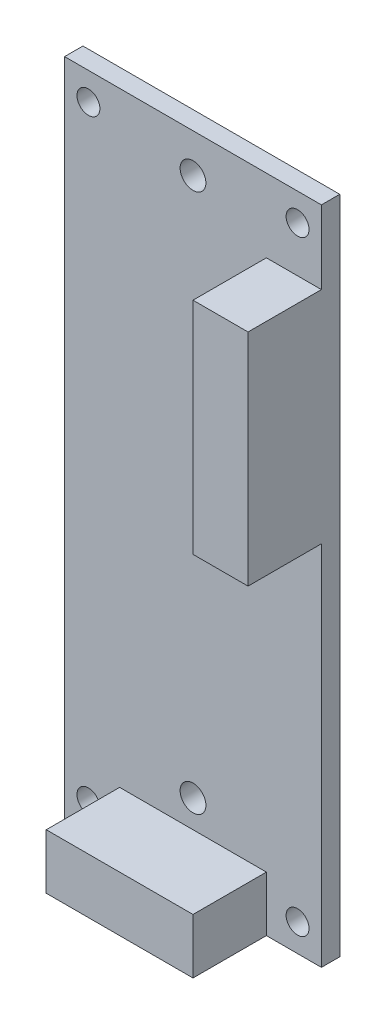
ISO-10303-21;
HEADER;
FILE_DESCRIPTION(('STEP AP214'),'2;1');
FILE_NAME('part.step','',(''),(''),'','','');
FILE_SCHEMA(('AUTOMOTIVE_DESIGN { 1 0 10303 214 1 1 1 1 }'));
ENDSEC;
DATA;
#1=APPLICATION_CONTEXT('core data for automotive mechanical design processes');
#2=APPLICATION_PROTOCOL_DEFINITION('international standard','automotive_design',2000,#1);
#3=PRODUCT_CONTEXT('',#1,'mechanical');
#4=PRODUCT('Part','Part','',(#3));
#5=PRODUCT_RELATED_PRODUCT_CATEGORY('part','',(#4));
#6=PRODUCT_DEFINITION_FORMATION('','',#4);
#7=PRODUCT_DEFINITION_CONTEXT('part definition',#1,'design');
#8=PRODUCT_DEFINITION('design','',#6,#7);
#9=PRODUCT_DEFINITION_SHAPE('','',#8);
#10=(LENGTH_UNIT() NAMED_UNIT(*) SI_UNIT(.MILLI.,.METRE.));
#11=(NAMED_UNIT(*) PLANE_ANGLE_UNIT() SI_UNIT($,.RADIAN.));
#12=(NAMED_UNIT(*) SI_UNIT($,.STERADIAN.) SOLID_ANGLE_UNIT());
#13=UNCERTAINTY_MEASURE_WITH_UNIT(LENGTH_MEASURE(1.E-05),#10,'distance_accuracy_value','');
#14=(GEOMETRIC_REPRESENTATION_CONTEXT(3) GLOBAL_UNCERTAINTY_ASSIGNED_CONTEXT((#13)) GLOBAL_UNIT_ASSIGNED_CONTEXT((#10,
#11,#12)) REPRESENTATION_CONTEXT('',''));
#15=CARTESIAN_POINT('',(0.,0.,0.));
#16=DIRECTION('',(0.,0.,1.));
#17=DIRECTION('',(1.,0.,0.));
#18=AXIS2_PLACEMENT_3D('',#15,#16,#17);
#19=CARTESIAN_POINT('',(17.78,45.72,2.54));
#20=DIRECTION('',(0.,0.,-1.));
#21=DIRECTION('',(-1.,0.,0.));
#22=AXIS2_PLACEMENT_3D('',#19,#20,#21);
#23=PLANE('',#22);
#24=CARTESIAN_POINT('',(0.,-34.29,2.54));
#25=DIRECTION('',(0.,0.,1.));
#26=DIRECTION('',(1.,0.,0.));
#27=AXIS2_PLACEMENT_3D('',#24,#25,#26);
#28=CIRCLE('',#27,1.78435);
#29=CARTESIAN_POINT('',(1.78435,-34.29,2.54));
#30=VERTEX_POINT('',#29);
#31=EDGE_CURVE('E196',#30,#30,#28,.T.);
#32=ORIENTED_EDGE('',*,*,#31,.F.);
#33=EDGE_LOOP('',(#32));
#34=FACE_BOUND('',#33,.T.);
#35=CARTESIAN_POINT('',(0.,40.3498746289804,2.54));
#36=DIRECTION('',(0.,0.,1.));
#37=DIRECTION('',(1.,0.,0.));
#38=AXIS2_PLACEMENT_3D('',#35,#36,#37);
#39=CIRCLE('',#38,1.78435);
#40=CARTESIAN_POINT('',(1.78435,40.3498746289804,2.54));
#41=VERTEX_POINT('',#40);
#42=EDGE_CURVE('E201',#41,#41,#39,.T.);
#43=ORIENTED_EDGE('',*,*,#42,.F.);
#44=EDGE_LOOP('',(#43));
#45=FACE_BOUND('',#44,.T.);
#46=CARTESIAN_POINT('',(14.478,-41.91,2.54));
#47=DIRECTION('',(0.,0.,1.));
#48=DIRECTION('',(1.,0.,0.));
#49=AXIS2_PLACEMENT_3D('',#46,#47,#48);
#50=CIRCLE('',#49,1.5875);
#51=CARTESIAN_POINT('',(16.0655,-41.91,2.54));
#52=VERTEX_POINT('',#51);
#53=EDGE_CURVE('E205',#52,#52,#50,.T.);
#54=ORIENTED_EDGE('',*,*,#53,.F.);
#55=EDGE_LOOP('',(#54));
#56=FACE_BOUND('',#55,.T.);
#57=CARTESIAN_POINT('',(-14.478,-41.91,2.54));
#58=DIRECTION('',(0.,0.,1.));
#59=DIRECTION('',(1.,0.,0.));
#60=AXIS2_PLACEMENT_3D('',#57,#58,#59);
#61=CIRCLE('',#60,1.5875);
#62=CARTESIAN_POINT('',(-12.8905,-41.91,2.54));
#63=VERTEX_POINT('',#62);
#64=EDGE_CURVE('E209',#63,#63,#61,.T.);
#65=ORIENTED_EDGE('',*,*,#64,.F.);
#66=EDGE_LOOP('',(#65));
#67=FACE_BOUND('',#66,.T.);
#68=CARTESIAN_POINT('',(-14.478,41.91,2.54));
#69=DIRECTION('',(0.,0.,1.));
#70=DIRECTION('',(1.,0.,0.));
#71=AXIS2_PLACEMENT_3D('',#68,#69,#70);
#72=CIRCLE('',#71,1.5875);
#73=CARTESIAN_POINT('',(-12.8905,41.91,2.54));
#74=VERTEX_POINT('',#73);
#75=EDGE_CURVE('E215',#74,#74,#72,.T.);
#76=ORIENTED_EDGE('',*,*,#75,.F.);
#77=EDGE_LOOP('',(#76));
#78=FACE_BOUND('',#77,.T.);
#79=CARTESIAN_POINT('',(14.478,41.91,2.54));
#80=DIRECTION('',(0.,0.,1.));
#81=DIRECTION('',(1.,0.,0.));
#82=AXIS2_PLACEMENT_3D('',#79,#80,#81);
#83=CIRCLE('',#82,1.5875);
#84=CARTESIAN_POINT('',(16.0655,41.91,2.54));
#85=VERTEX_POINT('',#84);
#86=EDGE_CURVE('E221',#85,#85,#83,.T.);
#87=ORIENTED_EDGE('',*,*,#86,.F.);
#88=EDGE_LOOP('',(#87));
#89=FACE_BOUND('',#88,.T.);
#90=DIRECTION('',(-1.,0.,0.));
#91=VECTOR('',#90,1.);
#92=CARTESIAN_POINT('',(17.78,35.56,2.54));
#93=LINE('',#92,#91);
#94=CARTESIAN_POINT('',(17.78,35.56,2.54));
#95=VERTEX_POINT('',#94);
#96=CARTESIAN_POINT('',(10.16,35.56,2.54));
#97=VERTEX_POINT('',#96);
#98=EDGE_CURVE('E274',#95,#97,#93,.T.);
#99=ORIENTED_EDGE('',*,*,#98,.F.);
#100=DIRECTION('',(0.,1.,0.));
#101=VECTOR('',#100,1.);
#102=CARTESIAN_POINT('',(17.78,-45.72,2.54));
#103=LINE('',#102,#101);
#104=CARTESIAN_POINT('',(17.78,45.72,2.54));
#105=VERTEX_POINT('',#104);
#106=EDGE_CURVE('E149',#95,#105,#103,.T.);
#107=ORIENTED_EDGE('',*,*,#106,.T.);
#108=DIRECTION('',(-1.,0.,0.));
#109=VECTOR('',#108,1.);
#110=CARTESIAN_POINT('',(-17.78,45.72,2.54));
#111=LINE('',#110,#109);
#112=CARTESIAN_POINT('',(-17.78,45.72,2.54));
#113=VERTEX_POINT('',#112);
#114=EDGE_CURVE('E230',#105,#113,#111,.T.);
#115=ORIENTED_EDGE('',*,*,#114,.T.);
#116=DIRECTION('',(0.,-1.,0.));
#117=VECTOR('',#116,1.);
#118=CARTESIAN_POINT('',(-17.78,-45.72,2.54));
#119=LINE('',#118,#117);
#120=CARTESIAN_POINT('',(-17.78,-45.72,2.54));
#121=VERTEX_POINT('',#120);
#122=EDGE_CURVE('E232',#113,#121,#119,.T.);
#123=ORIENTED_EDGE('',*,*,#122,.T.);
#124=DIRECTION('',(1.,0.,0.));
#125=VECTOR('',#124,1.);
#126=CARTESIAN_POINT('',(-17.78,-45.72,2.54));
#127=LINE('',#126,#125);
#128=CARTESIAN_POINT('',(-10.16,-45.72,2.54));
#129=VERTEX_POINT('',#128);
#130=EDGE_CURVE('E241',#121,#129,#127,.T.);
#131=ORIENTED_EDGE('',*,*,#130,.T.);
#132=DIRECTION('',(0.,-1.,0.));
#133=VECTOR('',#132,1.);
#134=CARTESIAN_POINT('',(-10.16,-38.1,2.54));
#135=LINE('',#134,#133);
#136=CARTESIAN_POINT('',(-10.16,-38.1,2.54));
#137=VERTEX_POINT('',#136);
#138=EDGE_CURVE('E162',#137,#129,#135,.T.);
#139=ORIENTED_EDGE('',*,*,#138,.F.);
#140=DIRECTION('',(-1.,0.,0.));
#141=VECTOR('',#140,1.);
#142=CARTESIAN_POINT('',(10.16,-38.1,2.54));
#143=LINE('',#142,#141);
#144=CARTESIAN_POINT('',(10.16,-38.1,2.54));
#145=VERTEX_POINT('',#144);
#146=EDGE_CURVE('E153',#145,#137,#143,.T.);
#147=ORIENTED_EDGE('',*,*,#146,.F.);
#148=DIRECTION('',(0.,1.,0.));
#149=VECTOR('',#148,1.);
#150=CARTESIAN_POINT('',(10.16,-45.72,2.54));
#151=LINE('',#150,#149);
#152=CARTESIAN_POINT('',(10.16,-45.72,2.54));
#153=VERTEX_POINT('',#152);
#154=EDGE_CURVE('E150',#153,#145,#151,.T.);
#155=ORIENTED_EDGE('',*,*,#154,.F.);
#156=CARTESIAN_POINT('',(17.78,-45.72,2.54));
#157=VERTEX_POINT('',#156);
#158=EDGE_CURVE('E234',#153,#157,#127,.T.);
#159=ORIENTED_EDGE('',*,*,#158,.T.);
#160=CARTESIAN_POINT('',(17.78,5.08000000000001,2.54));
#161=VERTEX_POINT('',#160);
#162=EDGE_CURVE('E228',#157,#161,#103,.T.);
#163=ORIENTED_EDGE('',*,*,#162,.T.);
#164=DIRECTION('',(1.,0.,0.));
#165=VECTOR('',#164,1.);
#166=CARTESIAN_POINT('',(10.16,5.08,2.54));
#167=LINE('',#166,#165);
#168=CARTESIAN_POINT('',(10.16,5.08,2.54));
#169=VERTEX_POINT('',#168);
#170=EDGE_CURVE('E59',#169,#161,#167,.T.);
#171=ORIENTED_EDGE('',*,*,#170,.F.);
#172=DIRECTION('',(0.,-1.,0.));
#173=VECTOR('',#172,1.);
#174=CARTESIAN_POINT('',(10.16,35.56,2.54));
#175=LINE('',#174,#173);
#176=EDGE_CURVE('E54',#97,#169,#175,.T.);
#177=ORIENTED_EDGE('',*,*,#176,.F.);
#178=EDGE_LOOP('',(#99,#107,#115,#123,#131,#139,#147,#155,#159,#163,#171,#177));
#179=FACE_BOUND('',#178,.T.);
#180=ADVANCED_FACE('F37',(#34,#45,#56,#67,#78,#89,#179),#23,.F.);
#181=CARTESIAN_POINT('',(17.78,-45.72,2.54));
#182=DIRECTION('',(-1.,0.,0.));
#183=DIRECTION('',(0.,0.,1.));
#184=AXIS2_PLACEMENT_3D('',#181,#182,#183);
#185=PLANE('',#184);
#186=DIRECTION('',(0.,1.,0.));
#187=VECTOR('',#186,1.);
#188=CARTESIAN_POINT('',(17.78,-45.72,0.));
#189=LINE('',#188,#187);
#190=CARTESIAN_POINT('',(17.78,-45.72,0.));
#191=VERTEX_POINT('',#190);
#192=CARTESIAN_POINT('',(17.78,45.72,0.));
#193=VERTEX_POINT('',#192);
#194=EDGE_CURVE('E227',#191,#193,#189,.T.);
#195=ORIENTED_EDGE('',*,*,#194,.T.);
#196=DIRECTION('',(0.,0.,-1.));
#197=VECTOR('',#196,1.);
#198=CARTESIAN_POINT('',(17.78,45.72,2.54));
#199=LINE('',#198,#197);
#200=EDGE_CURVE('E11',#105,#193,#199,.T.);
#201=ORIENTED_EDGE('',*,*,#200,.F.);
#202=ORIENTED_EDGE('',*,*,#106,.F.);
#203=DIRECTION('',(0.,0.,-1.));
#204=VECTOR('',#203,1.);
#205=CARTESIAN_POINT('',(17.78,35.56,12.7));
#206=LINE('',#205,#204);
#207=CARTESIAN_POINT('',(17.78,35.56,12.7));
#208=VERTEX_POINT('',#207);
#209=EDGE_CURVE('E131',#208,#95,#206,.T.);
#210=ORIENTED_EDGE('',*,*,#209,.F.);
#211=DIRECTION('',(0.,1.,0.));
#212=VECTOR('',#211,1.);
#213=CARTESIAN_POINT('',(17.78,5.08,12.7));
#214=LINE('',#213,#212);
#215=CARTESIAN_POINT('',(17.78,5.08,12.7));
#216=VERTEX_POINT('',#215);
#217=EDGE_CURVE('E137',#216,#208,#214,.T.);
#218=ORIENTED_EDGE('',*,*,#217,.F.);
#219=DIRECTION('',(0.,0.,-1.));
#220=VECTOR('',#219,1.);
#221=CARTESIAN_POINT('',(17.78,5.08,12.7));
#222=LINE('',#221,#220);
#223=EDGE_CURVE('E281',#216,#161,#222,.T.);
#224=ORIENTED_EDGE('',*,*,#223,.T.);
#225=ORIENTED_EDGE('',*,*,#162,.F.);
#226=DIRECTION('',(0.,0.,-1.));
#227=VECTOR('',#226,1.);
#228=CARTESIAN_POINT('',(17.78,-45.72,2.54));
#229=LINE('',#228,#227);
#230=EDGE_CURVE('E243',#157,#191,#229,.T.);
#231=ORIENTED_EDGE('',*,*,#230,.T.);
#232=EDGE_LOOP('',(#195,#201,#202,#210,#218,#224,#225,#231));
#233=FACE_BOUND('',#232,.T.);
#234=ADVANCED_FACE('F39',(#233),#185,.F.);
#235=CARTESIAN_POINT('',(-17.78,45.72,2.54));
#236=DIRECTION('',(0.,-1.,0.));
#237=DIRECTION('',(0.,0.,-1.));
#238=AXIS2_PLACEMENT_3D('',#235,#236,#237);
#239=PLANE('',#238);
#240=DIRECTION('',(-1.,0.,0.));
#241=VECTOR('',#240,1.);
#242=CARTESIAN_POINT('',(-17.78,45.72,0.));
#243=LINE('',#242,#241);
#244=CARTESIAN_POINT('',(-17.78,45.72,0.));
#245=VERTEX_POINT('',#244);
#246=EDGE_CURVE('E260',#193,#245,#243,.T.);
#247=ORIENTED_EDGE('',*,*,#246,.T.);
#248=DIRECTION('',(0.,0.,-1.));
#249=VECTOR('',#248,1.);
#250=CARTESIAN_POINT('',(-17.78,45.72,2.54));
#251=LINE('',#250,#249);
#252=EDGE_CURVE('E46',#113,#245,#251,.T.);
#253=ORIENTED_EDGE('',*,*,#252,.F.);
#254=ORIENTED_EDGE('',*,*,#114,.F.);
#255=ORIENTED_EDGE('',*,*,#200,.T.);
#256=EDGE_LOOP('',(#247,#253,#254,#255));
#257=FACE_BOUND('',#256,.T.);
#258=ADVANCED_FACE('F271',(#257),#239,.F.);
#259=CARTESIAN_POINT('',(-17.78,-45.72,2.54));
#260=DIRECTION('',(1.,0.,0.));
#261=DIRECTION('',(0.,0.,-1.));
#262=AXIS2_PLACEMENT_3D('',#259,#260,#261);
#263=PLANE('',#262);
#264=DIRECTION('',(0.,-1.,0.));
#265=VECTOR('',#264,1.);
#266=CARTESIAN_POINT('',(-17.78,-45.72,0.));
#267=LINE('',#266,#265);
#268=CARTESIAN_POINT('',(-17.78,-45.72,0.));
#269=VERTEX_POINT('',#268);
#270=EDGE_CURVE('E259',#245,#269,#267,.T.);
#271=ORIENTED_EDGE('',*,*,#270,.T.);
#272=DIRECTION('',(0.,0.,-1.));
#273=VECTOR('',#272,1.);
#274=CARTESIAN_POINT('',(-17.78,-45.72,2.54));
#275=LINE('',#274,#273);
#276=EDGE_CURVE('E252',#121,#269,#275,.T.);
#277=ORIENTED_EDGE('',*,*,#276,.F.);
#278=ORIENTED_EDGE('',*,*,#122,.F.);
#279=ORIENTED_EDGE('',*,*,#252,.T.);
#280=EDGE_LOOP('',(#271,#277,#278,#279));
#281=FACE_BOUND('',#280,.T.);
#282=ADVANCED_FACE('F315',(#281),#263,.F.);
#283=CARTESIAN_POINT('',(-17.78,-45.72,2.54));
#284=DIRECTION('',(0.,1.,0.));
#285=DIRECTION('',(0.,0.,1.));
#286=AXIS2_PLACEMENT_3D('',#283,#284,#285);
#287=PLANE('',#286);
#288=DIRECTION('',(1.,0.,0.));
#289=VECTOR('',#288,1.);
#290=CARTESIAN_POINT('',(-17.78,-45.72,0.));
#291=LINE('',#290,#289);
#292=EDGE_CURVE('E257',#269,#191,#291,.T.);
#293=ORIENTED_EDGE('',*,*,#292,.T.);
#294=ORIENTED_EDGE('',*,*,#230,.F.);
#295=ORIENTED_EDGE('',*,*,#158,.F.);
#296=DIRECTION('',(0.,0.,-1.));
#297=VECTOR('',#296,1.);
#298=CARTESIAN_POINT('',(10.16,-45.72,12.7));
#299=LINE('',#298,#297);
#300=CARTESIAN_POINT('',(10.16,-45.72,12.7));
#301=VERTEX_POINT('',#300);
#302=EDGE_CURVE('E191',#301,#153,#299,.T.);
#303=ORIENTED_EDGE('',*,*,#302,.F.);
#304=DIRECTION('',(1.,0.,0.));
#305=VECTOR('',#304,1.);
#306=CARTESIAN_POINT('',(-10.16,-45.72,12.7));
#307=LINE('',#306,#305);
#308=CARTESIAN_POINT('',(-10.16,-45.72,12.7));
#309=VERTEX_POINT('',#308);
#310=EDGE_CURVE('E159',#309,#301,#307,.T.);
#311=ORIENTED_EDGE('',*,*,#310,.F.);
#312=DIRECTION('',(0.,0.,-1.));
#313=VECTOR('',#312,1.);
#314=CARTESIAN_POINT('',(-10.16,-45.72,12.7));
#315=LINE('',#314,#313);
#316=EDGE_CURVE('E168',#309,#129,#315,.T.);
#317=ORIENTED_EDGE('',*,*,#316,.T.);
#318=ORIENTED_EDGE('',*,*,#130,.F.);
#319=ORIENTED_EDGE('',*,*,#276,.T.);
#320=EDGE_LOOP('',(#293,#294,#295,#303,#311,#317,#318,#319));
#321=FACE_BOUND('',#320,.T.);
#322=ADVANCED_FACE('F311',(#321),#287,.F.);
#323=CARTESIAN_POINT('',(17.78,45.72,0.));
#324=DIRECTION('',(0.,0.,-1.));
#325=DIRECTION('',(-1.,0.,0.));
#326=AXIS2_PLACEMENT_3D('',#323,#324,#325);
#327=PLANE('',#326);
#328=CARTESIAN_POINT('',(0.,-34.29,0.));
#329=DIRECTION('',(0.,0.,-1.));
#330=DIRECTION('',(-1.,0.,0.));
#331=AXIS2_PLACEMENT_3D('',#328,#329,#330);
#332=CIRCLE('',#331,1.78435);
#333=CARTESIAN_POINT('',(-1.78435,-34.29,0.));
#334=VERTEX_POINT('',#333);
#335=EDGE_CURVE('E200',#334,#334,#332,.T.);
#336=ORIENTED_EDGE('',*,*,#335,.F.);
#337=EDGE_LOOP('',(#336));
#338=FACE_BOUND('',#337,.T.);
#339=CARTESIAN_POINT('',(0.,40.3498746289804,0.));
#340=DIRECTION('',(0.,0.,-1.));
#341=DIRECTION('',(-1.,0.,0.));
#342=AXIS2_PLACEMENT_3D('',#339,#340,#341);
#343=CIRCLE('',#342,1.78435);
#344=CARTESIAN_POINT('',(-1.78435,40.3498746289804,0.));
#345=VERTEX_POINT('',#344);
#346=EDGE_CURVE('E204',#345,#345,#343,.T.);
#347=ORIENTED_EDGE('',*,*,#346,.F.);
#348=EDGE_LOOP('',(#347));
#349=FACE_BOUND('',#348,.T.);
#350=CARTESIAN_POINT('',(14.478,-41.91,0.));
#351=DIRECTION('',(0.,0.,-1.));
#352=DIRECTION('',(-1.,0.,0.));
#353=AXIS2_PLACEMENT_3D('',#350,#351,#352);
#354=CIRCLE('',#353,1.5875);
#355=CARTESIAN_POINT('',(12.8905,-41.91,0.));
#356=VERTEX_POINT('',#355);
#357=EDGE_CURVE('E208',#356,#356,#354,.T.);
#358=ORIENTED_EDGE('',*,*,#357,.F.);
#359=EDGE_LOOP('',(#358));
#360=FACE_BOUND('',#359,.T.);
#361=CARTESIAN_POINT('',(-14.478,-41.91,0.));
#362=DIRECTION('',(0.,0.,-1.));
#363=DIRECTION('',(-1.,0.,0.));
#364=AXIS2_PLACEMENT_3D('',#361,#362,#363);
#365=CIRCLE('',#364,1.5875);
#366=CARTESIAN_POINT('',(-16.0655,-41.91,0.));
#367=VERTEX_POINT('',#366);
#368=EDGE_CURVE('E212',#367,#367,#365,.T.);
#369=ORIENTED_EDGE('',*,*,#368,.F.);
#370=EDGE_LOOP('',(#369));
#371=FACE_BOUND('',#370,.T.);
#372=CARTESIAN_POINT('',(-14.478,41.91,0.));
#373=DIRECTION('',(0.,0.,-1.));
#374=DIRECTION('',(-1.,0.,0.));
#375=AXIS2_PLACEMENT_3D('',#372,#373,#374);
#376=CIRCLE('',#375,1.5875);
#377=CARTESIAN_POINT('',(-16.0655,41.91,0.));
#378=VERTEX_POINT('',#377);
#379=EDGE_CURVE('E218',#378,#378,#376,.T.);
#380=ORIENTED_EDGE('',*,*,#379,.F.);
#381=EDGE_LOOP('',(#380));
#382=FACE_BOUND('',#381,.T.);
#383=CARTESIAN_POINT('',(14.478,41.91,0.));
#384=DIRECTION('',(0.,0.,-1.));
#385=DIRECTION('',(-1.,0.,0.));
#386=AXIS2_PLACEMENT_3D('',#383,#384,#385);
#387=CIRCLE('',#386,1.5875);
#388=CARTESIAN_POINT('',(12.8905,41.91,0.));
#389=VERTEX_POINT('',#388);
#390=EDGE_CURVE('E224',#389,#389,#387,.T.);
#391=ORIENTED_EDGE('',*,*,#390,.F.);
#392=EDGE_LOOP('',(#391));
#393=FACE_BOUND('',#392,.T.);
#394=ORIENTED_EDGE('',*,*,#194,.F.);
#395=ORIENTED_EDGE('',*,*,#292,.F.);
#396=ORIENTED_EDGE('',*,*,#270,.F.);
#397=ORIENTED_EDGE('',*,*,#246,.F.);
#398=EDGE_LOOP('',(#394,#395,#396,#397));
#399=FACE_BOUND('',#398,.T.);
#400=ADVANCED_FACE('F268',(#338,#349,#360,#371,#382,#393,#399),#327,.T.);
#401=CARTESIAN_POINT('',(14.478,41.91,2.54));
#402=DIRECTION('',(0.,0.,1.));
#403=DIRECTION('',(1.,0.,0.));
#404=AXIS2_PLACEMENT_3D('',#401,#402,#403);
#405=CYLINDRICAL_SURFACE('',#404,1.5875);
#406=ORIENTED_EDGE('',*,*,#390,.T.);
#407=EDGE_LOOP('',(#406));
#408=FACE_BOUND('',#407,.T.);
#409=ORIENTED_EDGE('',*,*,#86,.T.);
#410=EDGE_LOOP('',(#409));
#411=FACE_BOUND('',#410,.T.);
#412=ADVANCED_FACE('F307',(#408,#411),#405,.F.);
#413=CARTESIAN_POINT('',(-14.478,41.91,2.54));
#414=DIRECTION('',(0.,0.,1.));
#415=DIRECTION('',(1.,0.,0.));
#416=AXIS2_PLACEMENT_3D('',#413,#414,#415);
#417=CYLINDRICAL_SURFACE('',#416,1.5875);
#418=ORIENTED_EDGE('',*,*,#379,.T.);
#419=EDGE_LOOP('',(#418));
#420=FACE_BOUND('',#419,.T.);
#421=ORIENTED_EDGE('',*,*,#75,.T.);
#422=EDGE_LOOP('',(#421));
#423=FACE_BOUND('',#422,.T.);
#424=ADVANCED_FACE('F345',(#420,#423),#417,.F.);
#425=CARTESIAN_POINT('',(-14.478,-41.91,2.54));
#426=DIRECTION('',(0.,0.,1.));
#427=DIRECTION('',(1.,0.,0.));
#428=AXIS2_PLACEMENT_3D('',#425,#426,#427);
#429=CYLINDRICAL_SURFACE('',#428,1.5875);
#430=ORIENTED_EDGE('',*,*,#368,.T.);
#431=EDGE_LOOP('',(#430));
#432=FACE_BOUND('',#431,.T.);
#433=ORIENTED_EDGE('',*,*,#64,.T.);
#434=EDGE_LOOP('',(#433));
#435=FACE_BOUND('',#434,.T.);
#436=ADVANCED_FACE('F352',(#432,#435),#429,.F.);
#437=CARTESIAN_POINT('',(14.478,-41.91,2.54));
#438=DIRECTION('',(0.,0.,1.));
#439=DIRECTION('',(1.,0.,0.));
#440=AXIS2_PLACEMENT_3D('',#437,#438,#439);
#441=CYLINDRICAL_SURFACE('',#440,1.5875);
#442=ORIENTED_EDGE('',*,*,#357,.T.);
#443=EDGE_LOOP('',(#442));
#444=FACE_BOUND('',#443,.T.);
#445=ORIENTED_EDGE('',*,*,#53,.T.);
#446=EDGE_LOOP('',(#445));
#447=FACE_BOUND('',#446,.T.);
#448=ADVANCED_FACE('F359',(#444,#447),#441,.F.);
#449=CARTESIAN_POINT('',(0.,40.3498746289804,2.54));
#450=DIRECTION('',(0.,0.,1.));
#451=DIRECTION('',(1.,0.,0.));
#452=AXIS2_PLACEMENT_3D('',#449,#450,#451);
#453=CYLINDRICAL_SURFACE('',#452,1.78435);
#454=ORIENTED_EDGE('',*,*,#346,.T.);
#455=EDGE_LOOP('',(#454));
#456=FACE_BOUND('',#455,.T.);
#457=ORIENTED_EDGE('',*,*,#42,.T.);
#458=EDGE_LOOP('',(#457));
#459=FACE_BOUND('',#458,.T.);
#460=ADVANCED_FACE('F366',(#456,#459),#453,.F.);
#461=CARTESIAN_POINT('',(0.,-34.29,2.54));
#462=DIRECTION('',(0.,0.,1.));
#463=DIRECTION('',(1.,0.,0.));
#464=AXIS2_PLACEMENT_3D('',#461,#462,#463);
#465=CYLINDRICAL_SURFACE('',#464,1.78435);
#466=ORIENTED_EDGE('',*,*,#335,.T.);
#467=EDGE_LOOP('',(#466));
#468=FACE_BOUND('',#467,.T.);
#469=ORIENTED_EDGE('',*,*,#31,.T.);
#470=EDGE_LOOP('',(#469));
#471=FACE_BOUND('',#470,.T.);
#472=ADVANCED_FACE('F373',(#468,#471),#465,.F.);
#473=CARTESIAN_POINT('',(10.16,-45.72,12.7));
#474=DIRECTION('',(-1.,0.,0.));
#475=DIRECTION('',(0.,-1.,0.));
#476=AXIS2_PLACEMENT_3D('',#473,#474,#475);
#477=PLANE('',#476);
#478=ORIENTED_EDGE('',*,*,#154,.T.);
#479=DIRECTION('',(0.,0.,-1.));
#480=VECTOR('',#479,1.);
#481=CARTESIAN_POINT('',(10.16,-38.1,12.7));
#482=LINE('',#481,#480);
#483=CARTESIAN_POINT('',(10.16,-38.1,12.7));
#484=VERTEX_POINT('',#483);
#485=EDGE_CURVE('E186',#484,#145,#482,.T.);
#486=ORIENTED_EDGE('',*,*,#485,.F.);
#487=DIRECTION('',(0.,1.,0.));
#488=VECTOR('',#487,1.);
#489=CARTESIAN_POINT('',(10.16,-45.72,12.7));
#490=LINE('',#489,#488);
#491=EDGE_CURVE('E161',#301,#484,#490,.T.);
#492=ORIENTED_EDGE('',*,*,#491,.F.);
#493=ORIENTED_EDGE('',*,*,#302,.T.);
#494=EDGE_LOOP('',(#478,#486,#492,#493));
#495=FACE_BOUND('',#494,.T.);
#496=ADVANCED_FACE('F380',(#495),#477,.F.);
#497=CARTESIAN_POINT('',(10.16,-38.1,12.7));
#498=DIRECTION('',(0.,-1.,0.));
#499=DIRECTION('',(0.,0.,-1.));
#500=AXIS2_PLACEMENT_3D('',#497,#498,#499);
#501=PLANE('',#500);
#502=ORIENTED_EDGE('',*,*,#146,.T.);
#503=DIRECTION('',(0.,0.,-1.));
#504=VECTOR('',#503,1.);
#505=CARTESIAN_POINT('',(-10.16,-38.1,12.7));
#506=LINE('',#505,#504);
#507=CARTESIAN_POINT('',(-10.16,-38.1,12.7));
#508=VERTEX_POINT('',#507);
#509=EDGE_CURVE('E173',#508,#137,#506,.T.);
#510=ORIENTED_EDGE('',*,*,#509,.F.);
#511=DIRECTION('',(-1.,0.,0.));
#512=VECTOR('',#511,1.);
#513=CARTESIAN_POINT('',(10.16,-38.1,12.7));
#514=LINE('',#513,#512);
#515=EDGE_CURVE('E164',#484,#508,#514,.T.);
#516=ORIENTED_EDGE('',*,*,#515,.F.);
#517=ORIENTED_EDGE('',*,*,#485,.T.);
#518=EDGE_LOOP('',(#502,#510,#516,#517));
#519=FACE_BOUND('',#518,.T.);
#520=ADVANCED_FACE('F387',(#519),#501,.F.);
#521=CARTESIAN_POINT('',(-10.16,-38.1,12.7));
#522=DIRECTION('',(1.,0.,0.));
#523=DIRECTION('',(0.,1.,0.));
#524=AXIS2_PLACEMENT_3D('',#521,#522,#523);
#525=PLANE('',#524);
#526=ORIENTED_EDGE('',*,*,#138,.T.);
#527=ORIENTED_EDGE('',*,*,#316,.F.);
#528=DIRECTION('',(0.,-1.,0.));
#529=VECTOR('',#528,1.);
#530=CARTESIAN_POINT('',(-10.16,-38.1,12.7));
#531=LINE('',#530,#529);
#532=EDGE_CURVE('E166',#508,#309,#531,.T.);
#533=ORIENTED_EDGE('',*,*,#532,.F.);
#534=ORIENTED_EDGE('',*,*,#509,.T.);
#535=EDGE_LOOP('',(#526,#527,#533,#534));
#536=FACE_BOUND('',#535,.T.);
#537=ADVANCED_FACE('F395',(#536),#525,.F.);
#538=CARTESIAN_POINT('',(10.16,-45.72,12.7));
#539=DIRECTION('',(0.,0.,1.));
#540=DIRECTION('',(1.,0.,0.));
#541=AXIS2_PLACEMENT_3D('',#538,#539,#540);
#542=PLANE('',#541);
#543=ORIENTED_EDGE('',*,*,#310,.T.);
#544=ORIENTED_EDGE('',*,*,#491,.T.);
#545=ORIENTED_EDGE('',*,*,#515,.T.);
#546=ORIENTED_EDGE('',*,*,#532,.T.);
#547=EDGE_LOOP('',(#543,#544,#545,#546));
#548=FACE_BOUND('',#547,.T.);
#549=ADVANCED_FACE('F295',(#548),#542,.T.);
#550=CARTESIAN_POINT('',(17.78,35.56,12.7));
#551=DIRECTION('',(0.,-1.,0.));
#552=DIRECTION('',(0.,0.,-1.));
#553=AXIS2_PLACEMENT_3D('',#550,#551,#552);
#554=PLANE('',#553);
#555=ORIENTED_EDGE('',*,*,#98,.T.);
#556=DIRECTION('',(0.,0.,-1.));
#557=VECTOR('',#556,1.);
#558=CARTESIAN_POINT('',(10.16,35.56,12.7));
#559=LINE('',#558,#557);
#560=CARTESIAN_POINT('',(10.16,35.56,12.7));
#561=VERTEX_POINT('',#560);
#562=EDGE_CURVE('E133',#561,#97,#559,.T.);
#563=ORIENTED_EDGE('',*,*,#562,.F.);
#564=DIRECTION('',(-1.,0.,0.));
#565=VECTOR('',#564,1.);
#566=CARTESIAN_POINT('',(17.78,35.56,12.7));
#567=LINE('',#566,#565);
#568=EDGE_CURVE('E127',#208,#561,#567,.T.);
#569=ORIENTED_EDGE('',*,*,#568,.F.);
#570=ORIENTED_EDGE('',*,*,#209,.T.);
#571=EDGE_LOOP('',(#555,#563,#569,#570));
#572=FACE_BOUND('',#571,.T.);
#573=ADVANCED_FACE('F129',(#572),#554,.F.);
#574=CARTESIAN_POINT('',(10.16,35.56,12.7));
#575=DIRECTION('',(1.,0.,0.));
#576=DIRECTION('',(0.,1.,0.));
#577=AXIS2_PLACEMENT_3D('',#574,#575,#576);
#578=PLANE('',#577);
#579=ORIENTED_EDGE('',*,*,#176,.T.);
#580=DIRECTION('',(0.,0.,-1.));
#581=VECTOR('',#580,1.);
#582=CARTESIAN_POINT('',(10.16,5.08,12.7));
#583=LINE('',#582,#581);
#584=CARTESIAN_POINT('',(10.16,5.08,12.7));
#585=VERTEX_POINT('',#584);
#586=EDGE_CURVE('E155',#585,#169,#583,.T.);
#587=ORIENTED_EDGE('',*,*,#586,.F.);
#588=DIRECTION('',(0.,-1.,0.));
#589=VECTOR('',#588,1.);
#590=CARTESIAN_POINT('',(10.16,35.56,12.7));
#591=LINE('',#590,#589);
#592=EDGE_CURVE('E136',#561,#585,#591,.T.);
#593=ORIENTED_EDGE('',*,*,#592,.F.);
#594=ORIENTED_EDGE('',*,*,#562,.T.);
#595=EDGE_LOOP('',(#579,#587,#593,#594));
#596=FACE_BOUND('',#595,.T.);
#597=ADVANCED_FACE('F287',(#596),#578,.F.);
#598=CARTESIAN_POINT('',(10.16,5.08,12.7));
#599=DIRECTION('',(0.,1.,0.));
#600=DIRECTION('',(0.,0.,1.));
#601=AXIS2_PLACEMENT_3D('',#598,#599,#600);
#602=PLANE('',#601);
#603=ORIENTED_EDGE('',*,*,#170,.T.);
#604=ORIENTED_EDGE('',*,*,#223,.F.);
#605=DIRECTION('',(1.,0.,0.));
#606=VECTOR('',#605,1.);
#607=CARTESIAN_POINT('',(10.16,5.08,12.7));
#608=LINE('',#607,#606);
#609=EDGE_CURVE('E142',#585,#216,#608,.T.);
#610=ORIENTED_EDGE('',*,*,#609,.F.);
#611=ORIENTED_EDGE('',*,*,#586,.T.);
#612=EDGE_LOOP('',(#603,#604,#610,#611));
#613=FACE_BOUND('',#612,.T.);
#614=ADVANCED_FACE('F285',(#613),#602,.F.);
#615=CARTESIAN_POINT('',(17.78,35.56,12.7));
#616=DIRECTION('',(0.,0.,1.));
#617=DIRECTION('',(1.,0.,0.));
#618=AXIS2_PLACEMENT_3D('',#615,#616,#617);
#619=PLANE('',#618);
#620=ORIENTED_EDGE('',*,*,#217,.T.);
#621=ORIENTED_EDGE('',*,*,#568,.T.);
#622=ORIENTED_EDGE('',*,*,#592,.T.);
#623=ORIENTED_EDGE('',*,*,#609,.T.);
#624=EDGE_LOOP('',(#620,#621,#622,#623));
#625=FACE_BOUND('',#624,.T.);
#626=ADVANCED_FACE('F140',(#625),#619,.T.);
#627=CLOSED_SHELL('',(#180,#234,#258,#282,#322,#400,#412,#424,#436,#448,#460,#472,#496,#520,
#537,#549,#573,#597,#614,#626));
#628=MANIFOLD_SOLID_BREP('B2',#627);
#629=ADVANCED_BREP_SHAPE_REPRESENTATION('',(#18,#628),#14);
#630=SHAPE_DEFINITION_REPRESENTATION(#9,#629);
ENDSEC;
END-ISO-10303-21;
